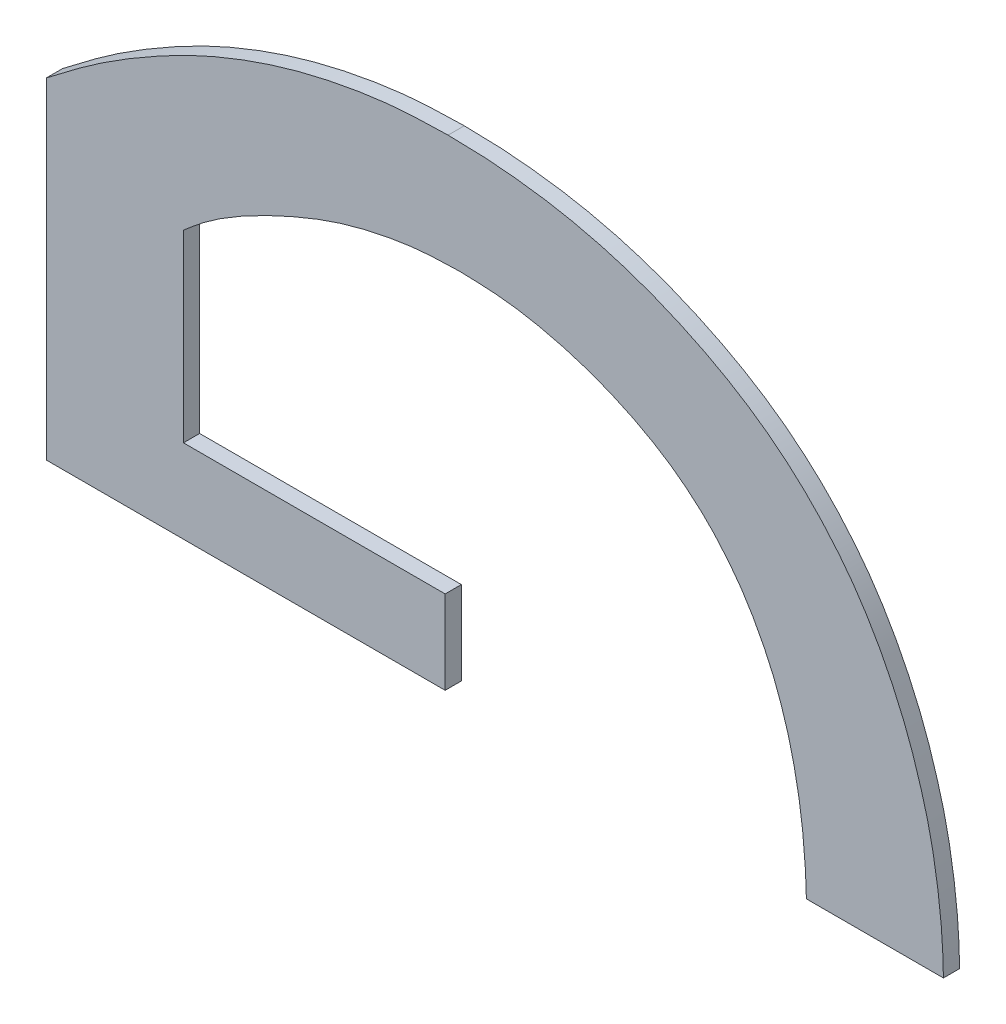
ISO-10303-21;
HEADER;
FILE_DESCRIPTION(('STEP AP214'),'2;1');
FILE_NAME('part.step','',(''),(''),'','','');
FILE_SCHEMA(('AUTOMOTIVE_DESIGN { 1 0 10303 214 1 1 1 1 }'));
ENDSEC;
DATA;
#1=APPLICATION_CONTEXT('core data for automotive mechanical design processes');
#2=APPLICATION_PROTOCOL_DEFINITION('international standard','automotive_design',2000,#1);
#3=PRODUCT_CONTEXT('',#1,'mechanical');
#4=PRODUCT('Part','Part','',(#3));
#5=PRODUCT_RELATED_PRODUCT_CATEGORY('part','',(#4));
#6=PRODUCT_DEFINITION_FORMATION('','',#4);
#7=PRODUCT_DEFINITION_CONTEXT('part definition',#1,'design');
#8=PRODUCT_DEFINITION('design','',#6,#7);
#9=PRODUCT_DEFINITION_SHAPE('','',#8);
#10=(LENGTH_UNIT() NAMED_UNIT(*) SI_UNIT(.MILLI.,.METRE.));
#11=(NAMED_UNIT(*) PLANE_ANGLE_UNIT() SI_UNIT($,.RADIAN.));
#12=(NAMED_UNIT(*) SI_UNIT($,.STERADIAN.) SOLID_ANGLE_UNIT());
#13=UNCERTAINTY_MEASURE_WITH_UNIT(LENGTH_MEASURE(1.E-05),#10,'distance_accuracy_value','');
#14=(GEOMETRIC_REPRESENTATION_CONTEXT(3) GLOBAL_UNCERTAINTY_ASSIGNED_CONTEXT((#13)) GLOBAL_UNIT_ASSIGNED_CONTEXT((#10,
#11,#12)) REPRESENTATION_CONTEXT('',''));
#15=CARTESIAN_POINT('',(0.,0.,0.));
#16=DIRECTION('',(0.,0.,1.));
#17=DIRECTION('',(1.,0.,0.));
#18=AXIS2_PLACEMENT_3D('',#15,#16,#17);
#19=CARTESIAN_POINT('',(-7.66146588641011,14.1280419590805,0.5));
#20=DIRECTION('',(0.,0.,1.));
#21=DIRECTION('',(0.,-1.,0.));
#22=AXIS2_PLACEMENT_3D('',#19,#20,#21);
#23=PLANE('',#22);
#24=CARTESIAN_POINT('',(-1.06370192307693,15.3846153846154,0.5));
#25=CARTESIAN_POINT('',(-0.700916352309094,15.3790467041961,0.5));
#26=CARTESIAN_POINT('',(0.0197697843500875,15.3679843271308,0.5));
#27=CARTESIAN_POINT('',(1.08678085567196,15.2733327192223,0.5));
#28=CARTESIAN_POINT('',(2.12888250244005,15.1327236546049,0.5));
#29=CARTESIAN_POINT('',(3.14407325761526,14.9258570221873,0.5));
#30=CARTESIAN_POINT('',(4.13419229673364,14.6633646719381,0.5));
#31=CARTESIAN_POINT('',(5.09963352682321,14.3375042256734,0.5));
#32=CARTESIAN_POINT('',(6.03732593184086,13.9505967593333,0.5));
#33=CARTESIAN_POINT('',(6.94887074224028,13.5158889325775,0.5));
#34=CARTESIAN_POINT('',(7.82082045885353,13.0227761723087,0.5));
#35=CARTESIAN_POINT('',(8.64535559553888,12.4785031778331,0.5));
#36=CARTESIAN_POINT('',(9.41150588113295,11.8736539713433,0.5));
#37=CARTESIAN_POINT('',(10.121652742584,11.2193493258502,0.5));
#38=CARTESIAN_POINT('',(10.7737111950012,10.5095230081931,0.5));
#39=CARTESIAN_POINT('',(11.3775702606555,9.75391254077148,0.5));
#40=CARTESIAN_POINT('',(11.9169422855875,8.93858260485831,0.5));
#41=CARTESIAN_POINT('',(12.403875410212,8.0785831186861,0.5));
#42=CARTESIAN_POINT('',(12.8334827363571,7.18029923142668,0.5));
#43=CARTESIAN_POINT('',(13.2099193647339,6.25183721058625,0.5));
#44=CARTESIAN_POINT('',(13.5156922078134,5.2951225304724,0.5));
#45=CARTESIAN_POINT('',(13.7899371888838,4.31779860923823,0.5));
#46=CARTESIAN_POINT('',(13.9803437431493,3.30954211352894,0.5));
#47=CARTESIAN_POINT('',(14.1285405217291,2.27726188773534,0.5));
#48=CARTESIAN_POINT('',(14.2120010997249,1.21932733908094,0.5));
#49=CARTESIAN_POINT('',(14.2244722316835,0.504942344689912,0.5));
#50=CARTESIAN_POINT('',(14.2307692307692,0.144230769230768,0.5));
#51=B_SPLINE_CURVE_WITH_KNOTS('',3,(#24,#25,#26,#27,#28,#29,#30,#31,#32,#33,#34,#35,#36,#37,#38,
#39,#40,#41,#42,#43,#44,#45,#46,#47,#48,#49,#50),.UNSPECIFIED.,.F.,.F.,(4,1,1,1,1,1,1,1,1,1,1,1,
1,1,1,1,1,1,1,1,1,1,1,1,4),(0.,0.0447005049946464,0.0887991057172511,0.131916621092586,
0.174231597976913,0.216388570883442,0.258076710559058,0.299703404268083,0.341330830010164,
0.382454501453172,0.423056914687857,0.462962125245202,0.502619151419145,0.54192732728699,
0.581638872251298,0.621693472537074,0.662265854396914,0.703341333007222,0.74432471734646,
0.785622893069838,0.827064702245339,0.86933140272337,0.911959915858504,0.955546270283426,1.),.UNSPECIFIED.);
#52=CARTESIAN_POINT('',(-1.06370192307693,15.3846153846154,0.5));
#53=VERTEX_POINT('',#52);
#54=CARTESIAN_POINT('',(14.224161741117,0.5,0.49999999999994));
#55=VERTEX_POINT('',#54);
#56=EDGE_CURVE('E251',#53,#55,#51,.T.);
#57=ORIENTED_EDGE('',*,*,#56,.T.);
#58=DIRECTION('',(-1.,0.,0.));
#59=VECTOR('',#58,1.);
#60=CARTESIAN_POINT('',(-7.66146588641011,0.5,0.499999999999973));
#61=LINE('',#60,#59);
#62=CARTESIAN_POINT('',(9.99491846258484,0.499999990253035,0.5));
#63=VERTEX_POINT('',#62);
#64=EDGE_CURVE('E285',#55,#63,#61,.T.);
#65=ORIENTED_EDGE('',*,*,#64,.T.);
#66=CARTESIAN_POINT('',(10.,-0.0120192307692321,0.5));
#67=CARTESIAN_POINT('',(9.99784318434349,0.312650851121588,0.5));
#68=CARTESIAN_POINT('',(9.99360463509661,0.95068875062042,0.5));
#69=CARTESIAN_POINT('',(9.92186057975612,1.88467252933055,0.5));
#70=CARTESIAN_POINT('',(9.82559335520481,2.78047381054095,0.5));
#71=CARTESIAN_POINT('',(9.67119527977938,3.63178722091421,0.5));
#72=CARTESIAN_POINT('',(9.48948884499875,4.4485941909892,0.5));
#73=CARTESIAN_POINT('',(9.25305583045935,5.2198302513314,0.5));
#74=CARTESIAN_POINT('',(8.98425943936081,5.9550517471758,0.5));
#75=CARTESIAN_POINT('',(8.66422030347741,6.64396919931545,0.5));
#76=CARTESIAN_POINT('',(8.3093572941315,7.29459768767767,0.5));
#77=CARTESIAN_POINT('',(7.92119468860591,7.90546511070815,0.5));
#78=CARTESIAN_POINT('',(7.48212983126328,8.4646432631468,0.5));
#79=CARTESIAN_POINT('',(7.01710221026362,8.99177257607355,0.5));
#80=CARTESIAN_POINT('',(6.50163642037249,9.46531601718474,0.5));
#81=CARTESIAN_POINT('',(5.95567963553489,9.9008573702477,0.5));
#82=CARTESIAN_POINT('',(5.36599545660061,10.2867778756222,0.5));
#83=CARTESIAN_POINT('',(4.53873188709285,10.7463400119471,0.5));
#84=CARTESIAN_POINT('',(3.45477013977203,11.2206466885827,0.5));
#85=CARTESIAN_POINT('',(2.10200386038248,11.6224553772018,0.5));
#86=CARTESIAN_POINT('',(0.711119452822841,11.8825131634935,0.5));
#87=CARTESIAN_POINT('',(-0.233223310269768,11.9094844594496,0.5));
#88=CARTESIAN_POINT('',(-0.709134615384619,11.9230769230769,0.5));
#89=B_SPLINE_CURVE_WITH_KNOTS('',3,(#66,#67,#68,#69,#70,#71,#72,#73,#74,#75,#76,#77,#78,#79,#80,
#81,#82,#83,#84,#85,#86,#87,#88),.UNSPECIFIED.,.F.,.F.,(4,1,1,1,1,1,1,1,1,1,1,1,1,1,1,1,1,1,1,1,
4),(0.,0.053540000345815,0.10521619103573,0.154442458489245,0.202086182476639,0.247856204399221,
0.292388054246818,0.335046456889112,0.376888206862538,0.417553465535913,0.457241707731969,
0.496105671165891,0.53471595066529,0.573060903281829,0.611404432102715,0.649804871572836,
0.689153265973265,0.767428525150751,0.844370024836177,0.92156866395349,1.),.UNSPECIFIED.);
#90=CARTESIAN_POINT('',(-0.709134615384619,11.9230769230769,0.5));
#91=VERTEX_POINT('',#90);
#92=EDGE_CURVE('E198',#63,#91,#89,.T.);
#93=ORIENTED_EDGE('',*,*,#92,.T.);
#94=CARTESIAN_POINT('',(-0.709134615384618,11.9230769230769,0.5));
#95=CARTESIAN_POINT('',(-1.1266316063045,11.9127927734792,0.5));
#96=CARTESIAN_POINT('',(-1.96010645647433,11.8922618948584,0.5));
#97=CARTESIAN_POINT('',(-3.19878086751128,11.6860829967294,0.5));
#98=CARTESIAN_POINT('',(-4.42557780133461,11.3799890868396,0.5));
#99=CARTESIAN_POINT('',(-5.60233253394538,10.9327335602244,0.5));
#100=CARTESIAN_POINT('',(-6.70154292919459,10.4306168987302,0.5));
#101=CARTESIAN_POINT('',(-7.68287573734842,9.90671231913559,0.5));
#102=CARTESIAN_POINT('',(-8.52555686326537,9.3637634669062,0.5));
#103=CARTESIAN_POINT('',(-9.0042262062592,8.95532406420325,0.5));
#104=CARTESIAN_POINT('',(-9.23076923076923,8.76201923076923,0.5));
#105=B_SPLINE_CURVE_WITH_KNOTS('',3,(#94,#95,#96,#97,#98,#99,#100,#101,#102,#103,#104),
.UNSPECIFIED.,.F.,.F.,(4,1,1,1,1,1,1,1,4),(0.,0.135036813573391,0.269582273425512,
0.405471199827009,0.543757336080233,0.676369914795714,0.79649033941373,0.903683628999787,1.),.UNSPECIFIED.);
#106=CARTESIAN_POINT('',(-9.23076923076923,8.76201923076923,0.5));
#107=VERTEX_POINT('',#106);
#108=EDGE_CURVE('E193',#91,#107,#105,.T.);
#109=ORIENTED_EDGE('',*,*,#108,.T.);
#110=DIRECTION('',(0.,-1.,0.));
#111=VECTOR('',#110,1.);
#112=CARTESIAN_POINT('',(-9.23076923076923,8.76201923076923,0.5));
#113=LINE('',#112,#111);
#114=CARTESIAN_POINT('',(-9.23076923076923,3.07692307692308,0.5));
#115=VERTEX_POINT('',#114);
#116=EDGE_CURVE('E132',#107,#115,#113,.T.);
#117=ORIENTED_EDGE('',*,*,#116,.T.);
#118=DIRECTION('',(1.,0.,0.));
#119=VECTOR('',#118,1.);
#120=CARTESIAN_POINT('',(-9.23076923076923,3.07692307692308,0.5));
#121=LINE('',#120,#119);
#122=CARTESIAN_POINT('',(-1.15384615384616,3.07692307692308,0.5));
#123=VERTEX_POINT('',#122);
#124=EDGE_CURVE('E129',#115,#123,#121,.T.);
#125=ORIENTED_EDGE('',*,*,#124,.T.);
#126=DIRECTION('',(0.,-1.,0.));
#127=VECTOR('',#126,1.);
#128=CARTESIAN_POINT('',(-1.15384615384616,3.07692307692308,0.5));
#129=LINE('',#128,#127);
#130=CARTESIAN_POINT('',(-1.15384615384616,0.5,0.499999999999963));
#131=VERTEX_POINT('',#130);
#132=EDGE_CURVE('E123',#123,#131,#129,.T.);
#133=ORIENTED_EDGE('',*,*,#132,.T.);
#134=CARTESIAN_POINT('',(-13.4615384615385,0.5,0.5));
#135=VERTEX_POINT('',#134);
#136=EDGE_CURVE('E77',#131,#135,#61,.T.);
#137=ORIENTED_EDGE('',*,*,#136,.T.);
#138=DIRECTION('',(0.,1.,0.));
#139=VECTOR('',#138,1.);
#140=CARTESIAN_POINT('',(-13.4615384615385,-0.384615384615386,0.5));
#141=LINE('',#140,#139);
#142=CARTESIAN_POINT('',(-13.4615384615385,10.7151442307692,0.5));
#143=VERTEX_POINT('',#142);
#144=EDGE_CURVE('E246',#135,#143,#141,.T.);
#145=ORIENTED_EDGE('',*,*,#144,.T.);
#146=CARTESIAN_POINT('',(-13.4615384615385,10.7151442307692,0.5));
#147=CARTESIAN_POINT('',(-12.9766415692256,11.0880794898175,0.5));
#148=CARTESIAN_POINT('',(-12.0240692128834,11.8207049698042,0.5));
#149=CARTESIAN_POINT('',(-10.5174180611981,12.7593572501235,0.5));
#150=CARTESIAN_POINT('',(-9.00276743109857,13.5749820541555,0.500000000000001));
#151=CARTESIAN_POINT('',(-7.45686733851983,14.2311582598858,0.5));
#152=CARTESIAN_POINT('',(-5.8890525111198,14.7464121665787,0.5));
#153=CARTESIAN_POINT('',(-4.29797912639967,15.1112469714339,0.5));
#154=CARTESIAN_POINT('',(-2.68722734653716,15.3448943127152,0.5));
#155=CARTESIAN_POINT('',(-1.6053547556288,15.3713633401473,0.5));
#156=CARTESIAN_POINT('',(-1.06370192307693,15.3846153846154,0.5));
#157=B_SPLINE_CURVE_WITH_KNOTS('',3,(#146,#147,#148,#149,#150,#151,#152,#153,#154,#155,#156),
.UNSPECIFIED.,.F.,.F.,(4,1,1,1,1,1,1,1,4),(0.,0.135794742543009,0.266766646546428,
0.393755634030052,0.517553177363716,0.639260643368937,0.759817571871958,0.879749710254229,1.),.UNSPECIFIED.);
#158=EDGE_CURVE('E247',#143,#53,#157,.T.);
#159=ORIENTED_EDGE('',*,*,#158,.T.);
#160=EDGE_LOOP('',(#57,#65,#93,#109,#117,#125,#133,#137,#145,#159));
#161=FACE_BOUND('',#160,.T.);
#162=ADVANCED_FACE('F39',(#161),#23,.F.);
#163=CARTESIAN_POINT('',(-7.66146588641011,14.1280419590805,1.));
#164=DIRECTION('',(0.,0.,1.));
#165=DIRECTION('',(0.,-1.,0.));
#166=AXIS2_PLACEMENT_3D('',#163,#164,#165);
#167=PLANE('',#166);
#168=DIRECTION('',(0.,1.,0.));
#169=VECTOR('',#168,1.);
#170=CARTESIAN_POINT('',(-13.4615384615385,-0.384615384615386,1.));
#171=LINE('',#170,#169);
#172=CARTESIAN_POINT('',(-13.4615384615385,0.5,1.));
#173=VERTEX_POINT('',#172);
#174=CARTESIAN_POINT('',(-13.4615384615385,10.7151442307692,1.));
#175=VERTEX_POINT('',#174);
#176=EDGE_CURVE('E142',#173,#175,#171,.T.);
#177=ORIENTED_EDGE('',*,*,#176,.F.);
#178=DIRECTION('',(1.,0.,0.));
#179=VECTOR('',#178,1.);
#180=CARTESIAN_POINT('',(-17.,0.5,1.));
#181=LINE('',#180,#179);
#182=CARTESIAN_POINT('',(-1.15384615384616,0.5,1.));
#183=VERTEX_POINT('',#182);
#184=EDGE_CURVE('E43',#173,#183,#181,.T.);
#185=ORIENTED_EDGE('',*,*,#184,.T.);
#186=DIRECTION('',(0.,-1.,0.));
#187=VECTOR('',#186,1.);
#188=CARTESIAN_POINT('',(-1.15384615384616,3.07692307692308,1.));
#189=LINE('',#188,#187);
#190=CARTESIAN_POINT('',(-1.15384615384616,3.07692307692308,1.));
#191=VERTEX_POINT('',#190);
#192=EDGE_CURVE('E144',#191,#183,#189,.T.);
#193=ORIENTED_EDGE('',*,*,#192,.F.);
#194=DIRECTION('',(1.,0.,0.));
#195=VECTOR('',#194,1.);
#196=CARTESIAN_POINT('',(-9.23076923076923,3.07692307692308,1.));
#197=LINE('',#196,#195);
#198=CARTESIAN_POINT('',(-9.23076923076923,3.07692307692308,1.));
#199=VERTEX_POINT('',#198);
#200=EDGE_CURVE('E141',#199,#191,#197,.T.);
#201=ORIENTED_EDGE('',*,*,#200,.F.);
#202=DIRECTION('',(0.,-1.,0.));
#203=VECTOR('',#202,1.);
#204=CARTESIAN_POINT('',(-9.23076923076923,8.76201923076923,1.));
#205=LINE('',#204,#203);
#206=CARTESIAN_POINT('',(-9.23076923076923,8.76201923076923,1.));
#207=VERTEX_POINT('',#206);
#208=EDGE_CURVE('E47',#207,#199,#205,.T.);
#209=ORIENTED_EDGE('',*,*,#208,.F.);
#210=CARTESIAN_POINT('',(-0.709134615384618,11.9230769230769,1.));
#211=CARTESIAN_POINT('',(-1.1266316063045,11.9127927734792,1.));
#212=CARTESIAN_POINT('',(-1.96010645647433,11.8922618948584,1.));
#213=CARTESIAN_POINT('',(-3.19878086751128,11.6860829967294,1.));
#214=CARTESIAN_POINT('',(-4.42557780133461,11.3799890868396,1.));
#215=CARTESIAN_POINT('',(-5.60233253394538,10.9327335602244,1.));
#216=CARTESIAN_POINT('',(-6.70154292919459,10.4306168987302,1.));
#217=CARTESIAN_POINT('',(-7.68287573734842,9.90671231913559,1.));
#218=CARTESIAN_POINT('',(-8.52555686326537,9.3637634669062,1.));
#219=CARTESIAN_POINT('',(-9.0042262062592,8.95532406420325,1.));
#220=CARTESIAN_POINT('',(-9.23076923076923,8.76201923076923,1.));
#221=B_SPLINE_CURVE_WITH_KNOTS('',3,(#210,#211,#212,#213,#214,#215,#216,#217,#218,#219,#220),
.UNSPECIFIED.,.F.,.F.,(4,1,1,1,1,1,1,1,4),(0.,0.135036813573391,0.269582273425512,
0.405471199827009,0.543757336080233,0.676369914795714,0.79649033941373,0.903683628999787,1.),.UNSPECIFIED.);
#222=CARTESIAN_POINT('',(-0.709134615384619,11.9230769230769,1.));
#223=VERTEX_POINT('',#222);
#224=EDGE_CURVE('E159',#223,#207,#221,.T.);
#225=ORIENTED_EDGE('',*,*,#224,.F.);
#226=CARTESIAN_POINT('',(10.,-0.0120192307692321,1.));
#227=CARTESIAN_POINT('',(9.99784318434349,0.312650851121588,1.));
#228=CARTESIAN_POINT('',(9.99360463509661,0.95068875062042,1.));
#229=CARTESIAN_POINT('',(9.92186057975612,1.88467252933055,1.));
#230=CARTESIAN_POINT('',(9.82559335520481,2.78047381054095,1.));
#231=CARTESIAN_POINT('',(9.67119527977938,3.63178722091421,1.));
#232=CARTESIAN_POINT('',(9.48948884499875,4.4485941909892,1.));
#233=CARTESIAN_POINT('',(9.25305583045935,5.2198302513314,1.));
#234=CARTESIAN_POINT('',(8.98425943936081,5.9550517471758,1.));
#235=CARTESIAN_POINT('',(8.66422030347741,6.64396919931545,1.));
#236=CARTESIAN_POINT('',(8.3093572941315,7.29459768767767,1.));
#237=CARTESIAN_POINT('',(7.92119468860591,7.90546511070815,1.));
#238=CARTESIAN_POINT('',(7.48212983126328,8.4646432631468,1.));
#239=CARTESIAN_POINT('',(7.01710221026362,8.99177257607355,1.));
#240=CARTESIAN_POINT('',(6.50163642037249,9.46531601718474,1.));
#241=CARTESIAN_POINT('',(5.95567963553489,9.9008573702477,1.));
#242=CARTESIAN_POINT('',(5.36599545660061,10.2867778756222,1.));
#243=CARTESIAN_POINT('',(4.53873188709285,10.7463400119471,1.));
#244=CARTESIAN_POINT('',(3.45477013977203,11.2206466885827,1.));
#245=CARTESIAN_POINT('',(2.10200386038248,11.6224553772018,1.));
#246=CARTESIAN_POINT('',(0.711119452822841,11.8825131634935,1.));
#247=CARTESIAN_POINT('',(-0.233223310269768,11.9094844594496,1.));
#248=CARTESIAN_POINT('',(-0.709134615384619,11.9230769230769,1.));
#249=B_SPLINE_CURVE_WITH_KNOTS('',3,(#226,#227,#228,#229,#230,#231,#232,#233,#234,#235,#236,
#237,#238,#239,#240,#241,#242,#243,#244,#245,#246,#247,#248),.UNSPECIFIED.,.F.,.F.,(4,1,1,1,1,1,
1,1,1,1,1,1,1,1,1,1,1,1,1,1,4),(0.,0.053540000345815,0.10521619103573,0.154442458489245,
0.202086182476639,0.247856204399221,0.292388054246818,0.335046456889112,0.376888206862538,
0.417553465535913,0.457241707731969,0.496105671165891,0.53471595066529,0.573060903281829,
0.611404432102715,0.649804871572836,0.689153265973265,0.767428525150751,0.844370024836177,
0.92156866395349,1.),.UNSPECIFIED.);
#250=CARTESIAN_POINT('',(9.99491846258484,0.5,1.));
#251=VERTEX_POINT('',#250);
#252=EDGE_CURVE('E167',#251,#223,#249,.T.);
#253=ORIENTED_EDGE('',*,*,#252,.F.);
#254=CARTESIAN_POINT('',(14.224161741117,0.5,1.));
#255=VERTEX_POINT('',#254);
#256=EDGE_CURVE('E194',#251,#255,#181,.T.);
#257=ORIENTED_EDGE('',*,*,#256,.T.);
#258=CARTESIAN_POINT('',(-1.06370192307693,15.3846153846154,1.));
#259=CARTESIAN_POINT('',(-0.700916352309094,15.3790467041961,1.));
#260=CARTESIAN_POINT('',(0.0197697843500875,15.3679843271308,1.));
#261=CARTESIAN_POINT('',(1.08678085567196,15.2733327192223,1.));
#262=CARTESIAN_POINT('',(2.12888250244005,15.1327236546049,1.));
#263=CARTESIAN_POINT('',(3.14407325761526,14.9258570221873,1.));
#264=CARTESIAN_POINT('',(4.13419229673364,14.6633646719381,1.));
#265=CARTESIAN_POINT('',(5.09963352682321,14.3375042256734,1.));
#266=CARTESIAN_POINT('',(6.03732593184086,13.9505967593333,1.));
#267=CARTESIAN_POINT('',(6.94887074224028,13.5158889325775,1.));
#268=CARTESIAN_POINT('',(7.82082045885353,13.0227761723087,1.));
#269=CARTESIAN_POINT('',(8.64535559553888,12.4785031778331,1.));
#270=CARTESIAN_POINT('',(9.41150588113295,11.8736539713433,1.));
#271=CARTESIAN_POINT('',(10.121652742584,11.2193493258502,1.));
#272=CARTESIAN_POINT('',(10.7737111950012,10.5095230081931,1.));
#273=CARTESIAN_POINT('',(11.3775702606555,9.75391254077148,1.));
#274=CARTESIAN_POINT('',(11.9169422855875,8.93858260485831,1.));
#275=CARTESIAN_POINT('',(12.403875410212,8.0785831186861,1.));
#276=CARTESIAN_POINT('',(12.8334827363571,7.18029923142668,1.));
#277=CARTESIAN_POINT('',(13.2099193647339,6.25183721058625,1.));
#278=CARTESIAN_POINT('',(13.5156922078134,5.2951225304724,1.));
#279=CARTESIAN_POINT('',(13.7899371888838,4.31779860923823,1.));
#280=CARTESIAN_POINT('',(13.9803437431493,3.30954211352894,1.));
#281=CARTESIAN_POINT('',(14.1285405217291,2.27726188773534,1.));
#282=CARTESIAN_POINT('',(14.2120010997249,1.21932733908094,1.));
#283=CARTESIAN_POINT('',(14.2244722316835,0.504942344689912,1.));
#284=CARTESIAN_POINT('',(14.2307692307692,0.144230769230768,1.));
#285=B_SPLINE_CURVE_WITH_KNOTS('',3,(#258,#259,#260,#261,#262,#263,#264,#265,#266,#267,#268,
#269,#270,#271,#272,#273,#274,#275,#276,#277,#278,#279,#280,#281,#282,#283,#284),.UNSPECIFIED.,
.F.,.F.,(4,1,1,1,1,1,1,1,1,1,1,1,1,1,1,1,1,1,1,1,1,1,1,1,4),(0.,0.0447005049946464,
0.0887991057172511,0.131916621092586,0.174231597976913,0.216388570883442,0.258076710559058,
0.299703404268083,0.341330830010164,0.382454501453172,0.423056914687857,0.462962125245202,
0.502619151419145,0.54192732728699,0.581638872251298,0.621693472537074,0.662265854396914,
0.703341333007222,0.74432471734646,0.785622893069838,0.827064702245339,0.86933140272337,
0.911959915858504,0.955546270283426,1.),.UNSPECIFIED.);
#286=CARTESIAN_POINT('',(-1.06370192307693,15.3846153846154,1.));
#287=VERTEX_POINT('',#286);
#288=EDGE_CURVE('E152',#287,#255,#285,.T.);
#289=ORIENTED_EDGE('',*,*,#288,.F.);
#290=CARTESIAN_POINT('',(-13.4615384615385,10.7151442307692,1.));
#291=CARTESIAN_POINT('',(-12.9766415692256,11.0880794898175,1.));
#292=CARTESIAN_POINT('',(-12.0240692128834,11.8207049698042,1.));
#293=CARTESIAN_POINT('',(-10.5174180611981,12.7593572501235,1.));
#294=CARTESIAN_POINT('',(-9.00276743109857,13.5749820541555,1.));
#295=CARTESIAN_POINT('',(-7.45686733851983,14.2311582598858,1.));
#296=CARTESIAN_POINT('',(-5.8890525111198,14.7464121665787,1.));
#297=CARTESIAN_POINT('',(-4.29797912639967,15.1112469714339,1.));
#298=CARTESIAN_POINT('',(-2.68722734653716,15.3448943127152,1.));
#299=CARTESIAN_POINT('',(-1.6053547556288,15.3713633401473,1.));
#300=CARTESIAN_POINT('',(-1.06370192307693,15.3846153846154,1.));
#301=B_SPLINE_CURVE_WITH_KNOTS('',3,(#290,#291,#292,#293,#294,#295,#296,#297,#298,#299,#300),
.UNSPECIFIED.,.F.,.F.,(4,1,1,1,1,1,1,1,4),(0.,0.135794742543009,0.266766646546428,
0.393755634030052,0.517553177363716,0.639260643368937,0.759817571871958,0.879749710254229,1.),.UNSPECIFIED.);
#302=EDGE_CURVE('E154',#175,#287,#301,.T.);
#303=ORIENTED_EDGE('',*,*,#302,.F.);
#304=EDGE_LOOP('',(#177,#185,#193,#201,#209,#225,#253,#257,#289,#303));
#305=FACE_BOUND('',#304,.T.);
#306=ADVANCED_FACE('F41',(#305),#167,.T.);
#307=CARTESIAN_POINT('',(-9.23076923076923,3.07692307692308,0.5));
#308=DIRECTION('',(0.,-1.,0.));
#309=DIRECTION('',(0.,0.,-1.));
#310=AXIS2_PLACEMENT_3D('',#307,#308,#309);
#311=PLANE('',#310);
#312=ORIENTED_EDGE('',*,*,#200,.T.);
#313=DIRECTION('',(0.,0.,1.));
#314=VECTOR('',#313,1.);
#315=CARTESIAN_POINT('',(-1.15384615384616,3.07692307692308,0.5));
#316=LINE('',#315,#314);
#317=EDGE_CURVE('E128',#123,#191,#316,.T.);
#318=ORIENTED_EDGE('',*,*,#317,.F.);
#319=ORIENTED_EDGE('',*,*,#124,.F.);
#320=DIRECTION('',(0.,0.,1.));
#321=VECTOR('',#320,1.);
#322=CARTESIAN_POINT('',(-9.23076923076923,3.07692307692308,0.5));
#323=LINE('',#322,#321);
#324=EDGE_CURVE('E162',#115,#199,#323,.T.);
#325=ORIENTED_EDGE('',*,*,#324,.T.);
#326=EDGE_LOOP('',(#312,#318,#319,#325));
#327=FACE_BOUND('',#326,.T.);
#328=ADVANCED_FACE('F137',(#327),#311,.F.);
#329=CARTESIAN_POINT('',(-1.15384615384616,3.07692307692308,0.5));
#330=DIRECTION('',(-1.,0.,0.));
#331=DIRECTION('',(0.,0.,1.));
#332=AXIS2_PLACEMENT_3D('',#329,#330,#331);
#333=PLANE('',#332);
#334=ORIENTED_EDGE('',*,*,#192,.T.);
#335=DIRECTION('',(0.,0.,-1.));
#336=VECTOR('',#335,1.);
#337=CARTESIAN_POINT('',(-1.15384615384616,0.5,0.5));
#338=LINE('',#337,#336);
#339=EDGE_CURVE('E74',#183,#131,#338,.T.);
#340=ORIENTED_EDGE('',*,*,#339,.T.);
#341=ORIENTED_EDGE('',*,*,#132,.F.);
#342=ORIENTED_EDGE('',*,*,#317,.T.);
#343=EDGE_LOOP('',(#334,#340,#341,#342));
#344=FACE_BOUND('',#343,.T.);
#345=ADVANCED_FACE('F125',(#344),#333,.F.);
#346=CARTESIAN_POINT('',(-13.4615384615385,-0.384615384615386,0.5));
#347=DIRECTION('',(1.,0.,0.));
#348=DIRECTION('',(0.,0.,-1.));
#349=AXIS2_PLACEMENT_3D('',#346,#347,#348);
#350=PLANE('',#349);
#351=ORIENTED_EDGE('',*,*,#144,.F.);
#352=DIRECTION('',(0.,0.,1.));
#353=VECTOR('',#352,1.);
#354=CARTESIAN_POINT('',(-13.4615384615385,0.5,0.5));
#355=LINE('',#354,#353);
#356=EDGE_CURVE('E79',#135,#173,#355,.T.);
#357=ORIENTED_EDGE('',*,*,#356,.T.);
#358=ORIENTED_EDGE('',*,*,#176,.T.);
#359=DIRECTION('',(0.,0.,1.));
#360=VECTOR('',#359,1.);
#361=CARTESIAN_POINT('',(-13.4615384615385,10.7151442307692,0.5));
#362=LINE('',#361,#360);
#363=EDGE_CURVE('E149',#143,#175,#362,.T.);
#364=ORIENTED_EDGE('',*,*,#363,.F.);
#365=EDGE_LOOP('',(#351,#357,#358,#364));
#366=FACE_BOUND('',#365,.T.);
#367=ADVANCED_FACE('F242',(#366),#350,.F.);
#368=DIRECTION('',(0.,0.,1.));
#369=VECTOR('',#368,1.);
#370=SURFACE_OF_LINEAR_EXTRUSION('',#157,#369);
#371=ORIENTED_EDGE('',*,*,#302,.T.);
#372=DIRECTION('',(0.,0.,1.));
#373=VECTOR('',#372,1.);
#374=CARTESIAN_POINT('',(-1.06370192307693,15.3846153846154,0.5));
#375=LINE('',#374,#373);
#376=EDGE_CURVE('E155',#53,#287,#375,.T.);
#377=ORIENTED_EDGE('',*,*,#376,.F.);
#378=ORIENTED_EDGE('',*,*,#158,.F.);
#379=ORIENTED_EDGE('',*,*,#363,.T.);
#380=EDGE_LOOP('',(#371,#377,#378,#379));
#381=FACE_BOUND('',#380,.T.);
#382=ADVANCED_FACE('F241',(#381),#370,.F.);
#383=DIRECTION('',(0.,0.,1.));
#384=VECTOR('',#383,1.);
#385=SURFACE_OF_LINEAR_EXTRUSION('',#51,#384);
#386=ORIENTED_EDGE('',*,*,#288,.T.);
#387=DIRECTION('',(0.,0.,1.));
#388=VECTOR('',#387,1.);
#389=CARTESIAN_POINT('',(14.224161741117,0.5,0.5));
#390=LINE('',#389,#388);
#391=EDGE_CURVE('E59',#255,#55,#390,.F.);
#392=ORIENTED_EDGE('',*,*,#391,.T.);
#393=ORIENTED_EDGE('',*,*,#56,.F.);
#394=ORIENTED_EDGE('',*,*,#376,.T.);
#395=EDGE_LOOP('',(#386,#392,#393,#394));
#396=FACE_BOUND('',#395,.T.);
#397=ADVANCED_FACE('F264',(#396),#385,.F.);
#398=DIRECTION('',(0.,0.,1.));
#399=VECTOR('',#398,1.);
#400=SURFACE_OF_LINEAR_EXTRUSION('',#89,#399);
#401=ORIENTED_EDGE('',*,*,#92,.F.);
#402=DIRECTION('',(0.,0.,1.));
#403=VECTOR('',#402,1.);
#404=CARTESIAN_POINT('',(9.99491846242411,0.5,0.5));
#405=LINE('',#404,#403);
#406=EDGE_CURVE('E157',#63,#251,#405,.T.);
#407=ORIENTED_EDGE('',*,*,#406,.T.);
#408=ORIENTED_EDGE('',*,*,#252,.T.);
#409=DIRECTION('',(0.,0.,1.));
#410=VECTOR('',#409,1.);
#411=CARTESIAN_POINT('',(-0.709134615384619,11.9230769230769,0.5));
#412=LINE('',#411,#410);
#413=EDGE_CURVE('E160',#91,#223,#412,.T.);
#414=ORIENTED_EDGE('',*,*,#413,.F.);
#415=EDGE_LOOP('',(#401,#407,#408,#414));
#416=FACE_BOUND('',#415,.T.);
#417=ADVANCED_FACE('F215',(#416),#400,.F.);
#418=DIRECTION('',(0.,0.,1.));
#419=VECTOR('',#418,1.);
#420=SURFACE_OF_LINEAR_EXTRUSION('',#105,#419);
#421=ORIENTED_EDGE('',*,*,#224,.T.);
#422=DIRECTION('',(0.,0.,1.));
#423=VECTOR('',#422,1.);
#424=CARTESIAN_POINT('',(-9.23076923076923,8.76201923076923,0.5));
#425=LINE('',#424,#423);
#426=EDGE_CURVE('E11',#107,#207,#425,.T.);
#427=ORIENTED_EDGE('',*,*,#426,.F.);
#428=ORIENTED_EDGE('',*,*,#108,.F.);
#429=ORIENTED_EDGE('',*,*,#413,.T.);
#430=EDGE_LOOP('',(#421,#427,#428,#429));
#431=FACE_BOUND('',#430,.T.);
#432=ADVANCED_FACE('F206',(#431),#420,.F.);
#433=CARTESIAN_POINT('',(-9.23076923076923,8.76201923076923,0.5));
#434=DIRECTION('',(-1.,0.,0.));
#435=DIRECTION('',(0.,0.,1.));
#436=AXIS2_PLACEMENT_3D('',#433,#434,#435);
#437=PLANE('',#436);
#438=ORIENTED_EDGE('',*,*,#208,.T.);
#439=ORIENTED_EDGE('',*,*,#324,.F.);
#440=ORIENTED_EDGE('',*,*,#116,.F.);
#441=ORIENTED_EDGE('',*,*,#426,.T.);
#442=EDGE_LOOP('',(#438,#439,#440,#441));
#443=FACE_BOUND('',#442,.T.);
#444=ADVANCED_FACE('F211',(#443),#437,.F.);
#445=CARTESIAN_POINT('',(-17.,0.5,1.));
#446=DIRECTION('',(0.,1.,0.));
#447=DIRECTION('',(0.,0.,1.));
#448=AXIS2_PLACEMENT_3D('',#445,#446,#447);
#449=PLANE('',#448);
#450=ORIENTED_EDGE('',*,*,#184,.F.);
#451=ORIENTED_EDGE('',*,*,#356,.F.);
#452=ORIENTED_EDGE('',*,*,#136,.F.);
#453=ORIENTED_EDGE('',*,*,#339,.F.);
#454=EDGE_LOOP('',(#450,#451,#452,#453));
#455=FACE_BOUND('',#454,.T.);
#456=ADVANCED_FACE('F219',(#455),#449,.F.);
#457=ORIENTED_EDGE('',*,*,#256,.F.);
#458=ORIENTED_EDGE('',*,*,#406,.F.);
#459=ORIENTED_EDGE('',*,*,#64,.F.);
#460=ORIENTED_EDGE('',*,*,#391,.F.);
#461=EDGE_LOOP('',(#457,#458,#459,#460));
#462=FACE_BOUND('',#461,.T.);
#463=ADVANCED_FACE('F221',(#462),#449,.F.);
#464=CLOSED_SHELL('',(#162,#306,#328,#345,#367,#382,#397,#417,#432,#444,#456,#463));
#465=MANIFOLD_SOLID_BREP('B2',#464);
#466=ADVANCED_BREP_SHAPE_REPRESENTATION('',(#18,#465),#14);
#467=SHAPE_DEFINITION_REPRESENTATION(#9,#466);
ENDSEC;
END-ISO-10303-21;
